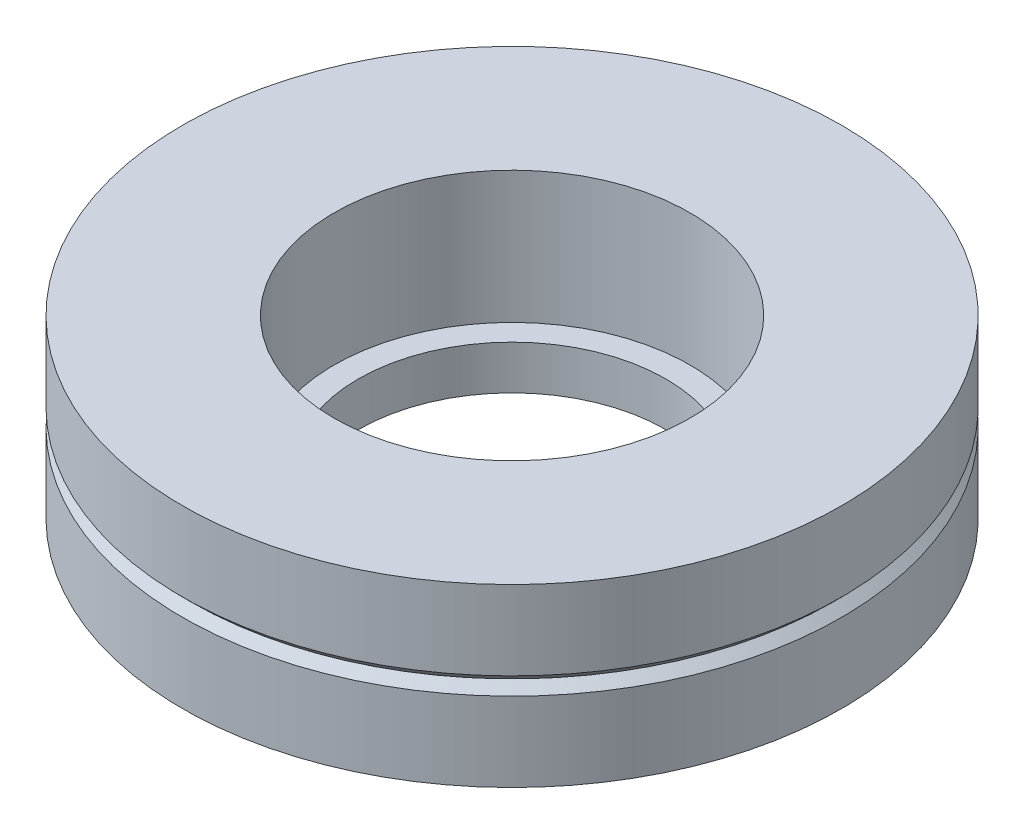
ISO-10303-21;
HEADER;
FILE_DESCRIPTION(('STEP AP214'),'2;1');
FILE_NAME('part.step','',(''),(''),'','','');
FILE_SCHEMA(('AUTOMOTIVE_DESIGN { 1 0 10303 214 1 1 1 1 }'));
ENDSEC;
DATA;
#1=APPLICATION_CONTEXT('core data for automotive mechanical design processes');
#2=APPLICATION_PROTOCOL_DEFINITION('international standard','automotive_design',2000,#1);
#3=PRODUCT_CONTEXT('',#1,'mechanical');
#4=PRODUCT('Part','Part','',(#3));
#5=PRODUCT_RELATED_PRODUCT_CATEGORY('part','',(#4));
#6=PRODUCT_DEFINITION_FORMATION('','',#4);
#7=PRODUCT_DEFINITION_CONTEXT('part definition',#1,'design');
#8=PRODUCT_DEFINITION('design','',#6,#7);
#9=PRODUCT_DEFINITION_SHAPE('','',#8);
#10=(LENGTH_UNIT() NAMED_UNIT(*) SI_UNIT(.MILLI.,.METRE.));
#11=(NAMED_UNIT(*) PLANE_ANGLE_UNIT() SI_UNIT($,.RADIAN.));
#12=(NAMED_UNIT(*) SI_UNIT($,.STERADIAN.) SOLID_ANGLE_UNIT());
#13=UNCERTAINTY_MEASURE_WITH_UNIT(LENGTH_MEASURE(1.E-05),#10,'distance_accuracy_value','');
#14=(GEOMETRIC_REPRESENTATION_CONTEXT(3) GLOBAL_UNCERTAINTY_ASSIGNED_CONTEXT((#13)) GLOBAL_UNIT_ASSIGNED_CONTEXT((#10,
#11,#12)) REPRESENTATION_CONTEXT('',''));
#15=CARTESIAN_POINT('',(0.,0.,0.));
#16=DIRECTION('',(0.,0.,1.));
#17=DIRECTION('',(1.,0.,0.));
#18=AXIS2_PLACEMENT_3D('',#15,#16,#17);
#19=CARTESIAN_POINT('',(0.,0.,0.));
#20=DIRECTION('',(0.,-1.,0.));
#21=DIRECTION('',(0.,0.,-1.));
#22=AXIS2_PLACEMENT_3D('',#19,#20,#21);
#23=CYLINDRICAL_SURFACE('',#22,15.);
#24=CARTESIAN_POINT('',(0.,8.,0.));
#25=DIRECTION('',(0.,-1.,0.));
#26=DIRECTION('',(0.,0.,-1.));
#27=AXIS2_PLACEMENT_3D('',#24,#25,#26);
#28=CIRCLE('',#27,15.);
#29=CARTESIAN_POINT('',(0.,8.,-15.));
#30=VERTEX_POINT('',#29);
#31=EDGE_CURVE('E52',#30,#30,#28,.T.);
#32=ORIENTED_EDGE('',*,*,#31,.T.);
#33=EDGE_LOOP('',(#32));
#34=FACE_BOUND('',#33,.T.);
#35=CARTESIAN_POINT('',(0.,4.4,0.));
#36=DIRECTION('',(0.,-1.,0.));
#37=DIRECTION('',(0.,0.,-1.));
#38=AXIS2_PLACEMENT_3D('',#35,#36,#37);
#39=CIRCLE('',#38,15.);
#40=CARTESIAN_POINT('',(0.,4.4,-15.));
#41=VERTEX_POINT('',#40);
#42=EDGE_CURVE('E10',#41,#41,#39,.T.);
#43=ORIENTED_EDGE('',*,*,#42,.F.);
#44=EDGE_LOOP('',(#43));
#45=FACE_BOUND('',#44,.T.);
#46=ADVANCED_FACE('F33',(#34,#45),#23,.T.);
#47=CARTESIAN_POINT('',(0.,4.,0.));
#48=DIRECTION('',(0.,1.,0.));
#49=DIRECTION('',(0.,0.,1.));
#50=AXIS2_PLACEMENT_3D('',#47,#48,#49);
#51=CONICAL_SURFACE('',#50,14.6,0.785398163397449);
#52=ORIENTED_EDGE('',*,*,#42,.T.);
#53=EDGE_LOOP('',(#52));
#54=FACE_BOUND('',#53,.T.);
#55=CARTESIAN_POINT('',(0.,4.,0.));
#56=DIRECTION('',(0.,-1.,0.));
#57=DIRECTION('',(0.,0.,-1.));
#58=AXIS2_PLACEMENT_3D('',#55,#56,#57);
#59=CIRCLE('',#58,14.6);
#60=CARTESIAN_POINT('',(0.,4.,-14.6));
#61=VERTEX_POINT('',#60);
#62=EDGE_CURVE('E39',#61,#61,#59,.T.);
#63=ORIENTED_EDGE('',*,*,#62,.F.);
#64=EDGE_LOOP('',(#63));
#65=FACE_BOUND('',#64,.T.);
#66=ADVANCED_FACE('F91',(#54,#65),#51,.T.);
#67=CARTESIAN_POINT('',(0.,3.6,0.));
#68=DIRECTION('',(0.,-1.,0.));
#69=DIRECTION('',(0.,0.,-1.));
#70=AXIS2_PLACEMENT_3D('',#67,#68,#69);
#71=CONICAL_SURFACE('',#70,15.,0.785398163397449);
#72=ORIENTED_EDGE('',*,*,#62,.T.);
#73=EDGE_LOOP('',(#72));
#74=FACE_BOUND('',#73,.T.);
#75=CARTESIAN_POINT('',(0.,3.6,0.));
#76=DIRECTION('',(0.,-1.,0.));
#77=DIRECTION('',(0.,0.,-1.));
#78=AXIS2_PLACEMENT_3D('',#75,#76,#77);
#79=CIRCLE('',#78,15.);
#80=CARTESIAN_POINT('',(0.,3.6,-15.));
#81=VERTEX_POINT('',#80);
#82=EDGE_CURVE('E43',#81,#81,#79,.T.);
#83=ORIENTED_EDGE('',*,*,#82,.F.);
#84=EDGE_LOOP('',(#83));
#85=FACE_BOUND('',#84,.T.);
#86=ADVANCED_FACE('F95',(#74,#85),#71,.T.);
#87=CARTESIAN_POINT('',(0.,0.,0.));
#88=DIRECTION('',(0.,-1.,0.));
#89=DIRECTION('',(0.,0.,-1.));
#90=AXIS2_PLACEMENT_3D('',#87,#88,#89);
#91=CYLINDRICAL_SURFACE('',#90,15.);
#92=ORIENTED_EDGE('',*,*,#82,.T.);
#93=EDGE_LOOP('',(#92));
#94=FACE_BOUND('',#93,.T.);
#95=CARTESIAN_POINT('',(0.,0.,0.));
#96=DIRECTION('',(0.,-1.,0.));
#97=DIRECTION('',(0.,0.,-1.));
#98=AXIS2_PLACEMENT_3D('',#95,#96,#97);
#99=CIRCLE('',#98,15.);
#100=CARTESIAN_POINT('',(0.,0.,-15.));
#101=VERTEX_POINT('',#100);
#102=EDGE_CURVE('E47',#101,#101,#99,.T.);
#103=ORIENTED_EDGE('',*,*,#102,.F.);
#104=EDGE_LOOP('',(#103));
#105=FACE_BOUND('',#104,.T.);
#106=ADVANCED_FACE('F99',(#94,#105),#91,.T.);
#107=CARTESIAN_POINT('',(15.,0.,0.));
#108=DIRECTION('',(0.,-1.,0.));
#109=DIRECTION('',(0.,0.,-1.));
#110=AXIS2_PLACEMENT_3D('',#107,#108,#109);
#111=PLANE('',#110);
#112=CARTESIAN_POINT('',(0.,0.,0.));
#113=DIRECTION('',(0.,-1.,0.));
#114=DIRECTION('',(0.,0.,-1.));
#115=AXIS2_PLACEMENT_3D('',#112,#113,#114);
#116=CIRCLE('',#115,7.);
#117=CARTESIAN_POINT('',(0.,0.,-7.));
#118=VERTEX_POINT('',#117);
#119=EDGE_CURVE('E59',#118,#118,#116,.T.);
#120=ORIENTED_EDGE('',*,*,#119,.F.);
#121=EDGE_LOOP('',(#120));
#122=FACE_BOUND('',#121,.T.);
#123=ORIENTED_EDGE('',*,*,#102,.T.);
#124=EDGE_LOOP('',(#123));
#125=FACE_BOUND('',#124,.T.);
#126=ADVANCED_FACE('F85',(#122,#125),#111,.T.);
#127=CARTESIAN_POINT('',(2.5,8.,0.));
#128=DIRECTION('',(0.,1.,0.));
#129=DIRECTION('',(0.,0.,1.));
#130=AXIS2_PLACEMENT_3D('',#127,#128,#129);
#131=PLANE('',#130);
#132=CARTESIAN_POINT('',(0.,8.,0.));
#133=DIRECTION('',(0.,1.,0.));
#134=DIRECTION('',(0.,0.,1.));
#135=AXIS2_PLACEMENT_3D('',#132,#133,#134);
#136=CIRCLE('',#135,8.1);
#137=CARTESIAN_POINT('',(0.,8.,8.1));
#138=VERTEX_POINT('',#137);
#139=EDGE_CURVE('E56',#138,#138,#136,.T.);
#140=ORIENTED_EDGE('',*,*,#139,.F.);
#141=EDGE_LOOP('',(#140));
#142=FACE_BOUND('',#141,.T.);
#143=ORIENTED_EDGE('',*,*,#31,.F.);
#144=EDGE_LOOP('',(#143));
#145=FACE_BOUND('',#144,.T.);
#146=ADVANCED_FACE('F79',(#142,#145),#131,.T.);
#147=CARTESIAN_POINT('',(0.,2.,0.));
#148=DIRECTION('',(0.,1.,0.));
#149=DIRECTION('',(0.,0.,1.));
#150=AXIS2_PLACEMENT_3D('',#147,#148,#149);
#151=CYLINDRICAL_SURFACE('',#150,8.1);
#152=CARTESIAN_POINT('',(0.,2.,0.));
#153=DIRECTION('',(0.,1.,0.));
#154=DIRECTION('',(0.,0.,1.));
#155=AXIS2_PLACEMENT_3D('',#152,#153,#154);
#156=CIRCLE('',#155,8.1);
#157=CARTESIAN_POINT('',(0.,2.,8.1));
#158=VERTEX_POINT('',#157);
#159=EDGE_CURVE('E55',#158,#158,#156,.T.);
#160=ORIENTED_EDGE('',*,*,#159,.F.);
#161=EDGE_LOOP('',(#160));
#162=FACE_BOUND('',#161,.T.);
#163=ORIENTED_EDGE('',*,*,#139,.T.);
#164=EDGE_LOOP('',(#163));
#165=FACE_BOUND('',#164,.T.);
#166=ADVANCED_FACE('F73',(#162,#165),#151,.F.);
#167=CARTESIAN_POINT('',(0.,2.,0.));
#168=DIRECTION('',(0.,1.,0.));
#169=DIRECTION('',(0.,0.,1.));
#170=AXIS2_PLACEMENT_3D('',#167,#168,#169);
#171=PLANE('',#170);
#172=CARTESIAN_POINT('',(0.,2.,0.));
#173=DIRECTION('',(0.,1.,0.));
#174=DIRECTION('',(0.,0.,1.));
#175=AXIS2_PLACEMENT_3D('',#172,#173,#174);
#176=CIRCLE('',#175,7.);
#177=CARTESIAN_POINT('',(0.,2.,7.));
#178=VERTEX_POINT('',#177);
#179=EDGE_CURVE('E64',#178,#178,#176,.T.);
#180=ORIENTED_EDGE('',*,*,#179,.F.);
#181=EDGE_LOOP('',(#180));
#182=FACE_BOUND('',#181,.T.);
#183=ORIENTED_EDGE('',*,*,#159,.T.);
#184=EDGE_LOOP('',(#183));
#185=FACE_BOUND('',#184,.T.);
#186=ADVANCED_FACE('F70',(#182,#185),#171,.T.);
#187=CARTESIAN_POINT('',(0.,-4.,0.));
#188=DIRECTION('',(0.,1.,0.));
#189=DIRECTION('',(0.,0.,1.));
#190=AXIS2_PLACEMENT_3D('',#187,#188,#189);
#191=CYLINDRICAL_SURFACE('',#190,7.);
#192=ORIENTED_EDGE('',*,*,#119,.T.);
#193=EDGE_LOOP('',(#192));
#194=FACE_BOUND('',#193,.T.);
#195=ORIENTED_EDGE('',*,*,#179,.T.);
#196=EDGE_LOOP('',(#195));
#197=FACE_BOUND('',#196,.T.);
#198=ADVANCED_FACE('F68',(#194,#197),#191,.F.);
#199=CLOSED_SHELL('',(#46,#66,#86,#106,#126,#146,#166,#186,#198));
#200=MANIFOLD_SOLID_BREP('B2',#199);
#201=ADVANCED_BREP_SHAPE_REPRESENTATION('',(#18,#200),#14);
#202=SHAPE_DEFINITION_REPRESENTATION(#9,#201);
ENDSEC;
END-ISO-10303-21;
